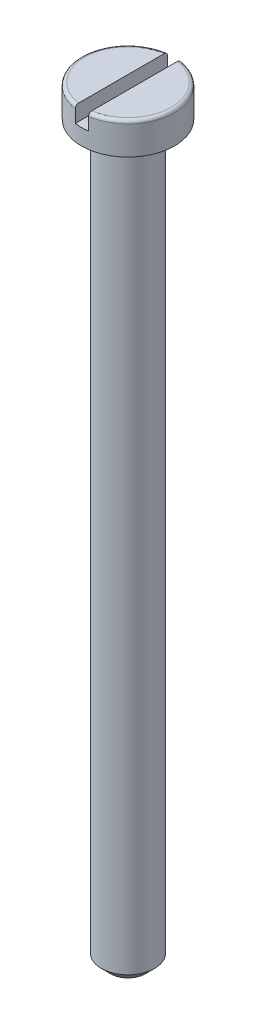
ISO-10303-21;
HEADER;
FILE_DESCRIPTION(('STEP AP214'),'2;1');
FILE_NAME('part.step','',(''),(''),'','','');
FILE_SCHEMA(('AUTOMOTIVE_DESIGN { 1 0 10303 214 1 1 1 1 }'));
ENDSEC;
DATA;
#1=APPLICATION_CONTEXT('core data for automotive mechanical design processes');
#2=APPLICATION_PROTOCOL_DEFINITION('international standard','automotive_design',2000,#1);
#3=PRODUCT_CONTEXT('',#1,'mechanical');
#4=PRODUCT('Part','Part','',(#3));
#5=PRODUCT_RELATED_PRODUCT_CATEGORY('part','',(#4));
#6=PRODUCT_DEFINITION_FORMATION('','',#4);
#7=PRODUCT_DEFINITION_CONTEXT('part definition',#1,'design');
#8=PRODUCT_DEFINITION('design','',#6,#7);
#9=PRODUCT_DEFINITION_SHAPE('','',#8);
#10=(LENGTH_UNIT() NAMED_UNIT(*) SI_UNIT(.MILLI.,.METRE.));
#11=(NAMED_UNIT(*) PLANE_ANGLE_UNIT() SI_UNIT($,.RADIAN.));
#12=(NAMED_UNIT(*) SI_UNIT($,.STERADIAN.) SOLID_ANGLE_UNIT());
#13=UNCERTAINTY_MEASURE_WITH_UNIT(LENGTH_MEASURE(1.E-05),#10,'distance_accuracy_value','');
#14=(GEOMETRIC_REPRESENTATION_CONTEXT(3) GLOBAL_UNCERTAINTY_ASSIGNED_CONTEXT((#13)) GLOBAL_UNIT_ASSIGNED_CONTEXT((#10,
#11,#12)) REPRESENTATION_CONTEXT('',''));
#15=CARTESIAN_POINT('',(0.,0.,0.));
#16=DIRECTION('',(0.,0.,1.));
#17=DIRECTION('',(1.,0.,0.));
#18=AXIS2_PLACEMENT_3D('',#15,#16,#17);
#19=CARTESIAN_POINT('',(0.,2.4,0.));
#20=DIRECTION('',(0.,1.,0.));
#21=DIRECTION('',(-1.,0.,0.));
#22=AXIS2_PLACEMENT_3D('',#19,#20,#21);
#23=CYLINDRICAL_SURFACE('',#22,3.5);
#24=CARTESIAN_POINT('',(0.,0.,0.));
#25=DIRECTION('',(0.,1.,0.));
#26=DIRECTION('',(-1.,0.,0.));
#27=AXIS2_PLACEMENT_3D('',#24,#25,#26);
#28=CIRCLE('',#27,3.5);
#29=CARTESIAN_POINT('',(-3.5,0.,0.));
#30=VERTEX_POINT('',#29);
#31=EDGE_CURVE('E115',#30,#30,#28,.T.);
#32=ORIENTED_EDGE('',*,*,#31,.T.);
#33=EDGE_LOOP('',(#32));
#34=FACE_BOUND('',#33,.T.);
#35=DIRECTION('',(0.,1.,0.));
#36=VECTOR('',#35,1.);
#37=CARTESIAN_POINT('',(0.499999999999999,2.4,3.46410161513775));
#38=LINE('',#37,#36);
#39=CARTESIAN_POINT('',(0.499999999999999,1.2,3.46410161513775));
#40=VERTEX_POINT('',#39);
#41=CARTESIAN_POINT('',(0.499999999999999,2.15999999999947,3.46410161513782));
#42=VERTEX_POINT('',#41);
#43=EDGE_CURVE('E166',#40,#42,#38,.T.);
#44=ORIENTED_EDGE('',*,*,#43,.F.);
#45=CARTESIAN_POINT('',(0.,1.2,0.));
#46=DIRECTION('',(0.,-1.,0.));
#47=DIRECTION('',(0.,0.,-1.));
#48=AXIS2_PLACEMENT_3D('',#45,#46,#47);
#49=CIRCLE('',#48,3.5);
#50=CARTESIAN_POINT('',(-0.500000000000001,1.2,3.46410161513775));
#51=VERTEX_POINT('',#50);
#52=EDGE_CURVE('E11',#40,#51,#49,.T.);
#53=ORIENTED_EDGE('',*,*,#52,.T.);
#54=DIRECTION('',(0.,1.,0.));
#55=VECTOR('',#54,1.);
#56=CARTESIAN_POINT('',(-0.500000000000001,2.4,3.46410161513775));
#57=LINE('',#56,#55);
#58=CARTESIAN_POINT('',(-0.500000000000001,2.15999999999923,3.46410161514339));
#59=VERTEX_POINT('',#58);
#60=EDGE_CURVE('E102',#59,#51,#57,.F.);
#61=ORIENTED_EDGE('',*,*,#60,.F.);
#62=CARTESIAN_POINT('',(0.,2.16,0.));
#63=DIRECTION('',(0.,1.,0.));
#64=DIRECTION('',(-1.,0.,0.));
#65=AXIS2_PLACEMENT_3D('',#62,#63,#64);
#66=CIRCLE('',#65,3.5);
#67=CARTESIAN_POINT('',(-0.5,2.160000000004,-3.46410161516349));
#68=VERTEX_POINT('',#67);
#69=EDGE_CURVE('E101',#68,#59,#66,.T.);
#70=ORIENTED_EDGE('',*,*,#69,.F.);
#71=DIRECTION('',(0.,1.,0.));
#72=VECTOR('',#71,1.);
#73=CARTESIAN_POINT('',(-0.5,2.4,-3.46410161513775));
#74=LINE('',#73,#72);
#75=CARTESIAN_POINT('',(-0.5,1.2,-3.46410161513775));
#76=VERTEX_POINT('',#75);
#77=EDGE_CURVE('E131',#76,#68,#74,.T.);
#78=ORIENTED_EDGE('',*,*,#77,.F.);
#79=CARTESIAN_POINT('',(0.5,1.2,-3.46410161513775));
#80=VERTEX_POINT('',#79);
#81=EDGE_CURVE('E38',#76,#80,#49,.T.);
#82=ORIENTED_EDGE('',*,*,#81,.T.);
#83=DIRECTION('',(0.,1.,0.));
#84=VECTOR('',#83,1.);
#85=CARTESIAN_POINT('',(0.5,2.4,-3.46410161513775));
#86=LINE('',#85,#84);
#87=CARTESIAN_POINT('',(0.5,2.16,-3.46410161513775));
#88=VERTEX_POINT('',#87);
#89=EDGE_CURVE('E107',#88,#80,#86,.F.);
#90=ORIENTED_EDGE('',*,*,#89,.F.);
#91=EDGE_CURVE('E114',#42,#88,#66,.T.);
#92=ORIENTED_EDGE('',*,*,#91,.F.);
#93=EDGE_LOOP('',(#44,#53,#61,#70,#78,#82,#90,#92));
#94=FACE_BOUND('',#93,.T.);
#95=ADVANCED_FACE('F34',(#34,#94),#23,.T.);
#96=CARTESIAN_POINT('',(0.,2.16,0.));
#97=DIRECTION('',(0.,1.,0.));
#98=DIRECTION('',(-1.,0.,0.));
#99=AXIS2_PLACEMENT_3D('',#96,#97,#98);
#100=TOROIDAL_SURFACE('',#99,3.26,0.24);
#101=CARTESIAN_POINT('',(0.5,2.241411028856,-3.44972387759937));
#102=CARTESIAN_POINT('',(0.5,2.22886304295098,-3.4542952341179));
#103=CARTESIAN_POINT('',(0.5,2.21592110891235,-3.45781267380693));
#104=CARTESIAN_POINT('',(0.5,2.1896200210776,-3.46262717209876));
#105=CARTESIAN_POINT('',(0.5,2.17626041187206,-3.46392171444181));
#106=CARTESIAN_POINT('',(0.5,2.1495179765406,-3.4642463732092));
#107=CARTESIAN_POINT('',(0.5,2.13613516216037,-3.46327741657342));
#108=CARTESIAN_POINT('',(0.5,2.10972597661162,-3.4591059150332));
#109=CARTESIAN_POINT('',(0.5,2.09669952377738,-3.4559038864038));
#110=CARTESIAN_POINT('',(0.5,2.07136797171093,-3.44736290151285));
#111=CARTESIAN_POINT('',(0.5,2.05906284473413,-3.44202402750344));
#112=CARTESIAN_POINT('',(0.5,2.03551638978496,-3.4293670241216));
#113=CARTESIAN_POINT('',(0.5,2.02427512011812,-3.42204878635329));
#114=CARTESIAN_POINT('',(0.5,2.00310659913289,-3.40560065008184));
#115=CARTESIAN_POINT('',(0.5,1.99318699464391,-3.3964609129393));
#116=CARTESIAN_POINT('',(0.5,1.9750050290174,-3.37666009434703));
#117=CARTESIAN_POINT('',(0.5,1.96674274264352,-3.36599894430162));
#118=CARTESIAN_POINT('',(0.5,1.95202349338991,-3.34334808764582));
#119=CARTESIAN_POINT('',(0.5,1.94558482161102,-3.33134649596625));
#120=CARTESIAN_POINT('',(0.5,1.93479012245546,-3.30644079110778));
#121=CARTESIAN_POINT('',(0.5,1.93043421030966,-3.29353662803843));
#122=CARTESIAN_POINT('',(0.5,1.92388331562625,-3.26704913949046));
#123=CARTESIAN_POINT('',(0.5,1.92171113692545,-3.25346017220783));
#124=CARTESIAN_POINT('',(0.5,1.91966204452503,-3.22611010372656));
#125=CARTESIAN_POINT('',(0.5,1.91978524018924,-3.21234899435737));
#126=CARTESIAN_POINT('',(0.5,1.92233049987845,-3.18494642839836));
#127=CARTESIAN_POINT('',(0.5,1.92476815321766,-3.17130641678393));
#128=CARTESIAN_POINT('',(0.5,1.93189894606612,-3.14462886869227));
#129=CARTESIAN_POINT('',(0.5,1.93659211471282,-3.13159134000049));
#130=CARTESIAN_POINT('',(0.5,1.94810648813214,-3.10649544180327));
#131=CARTESIAN_POINT('',(0.5,1.95492721642555,-3.09443685381974));
#132=CARTESIAN_POINT('',(0.5,1.97051187167998,-3.07164802720828));
#133=CARTESIAN_POINT('',(0.5,1.97927573199265,-3.06091774303993));
#134=CARTESIAN_POINT('',(0.5,1.99842599985092,-3.04118669217247));
#135=CARTESIAN_POINT('',(0.5,2.0087987380878,-3.03217266301152));
#136=CARTESIAN_POINT('',(0.5,2.03092701859961,-3.01604101129341));
#137=CARTESIAN_POINT('',(0.5,2.04268246113829,-3.00892325207663));
#138=CARTESIAN_POINT('',(0.5,2.06708136126523,-2.99688326290683));
#139=CARTESIAN_POINT('',(0.5,2.07971153041177,-2.99193410340201));
#140=CARTESIAN_POINT('',(0.5,2.10562908289139,-2.98425384684925));
#141=CARTESIAN_POINT('',(0.5,2.11891641876002,-2.98152258985877));
#142=CARTESIAN_POINT('',(0.5,2.14561077381066,-2.97838194468102));
#143=CARTESIAN_POINT('',(0.5,2.1590147672368,-2.97794679388834));
#144=CARTESIAN_POINT('',(0.5,2.18570394487786,-2.97934236410122));
#145=CARTESIAN_POINT('',(0.5,2.19898913300646,-2.98117301018796));
#146=CARTESIAN_POINT('',(0.5,2.22501330006813,-2.98703222894149));
#147=CARTESIAN_POINT('',(0.5,2.23775411885165,-2.99105264051188));
#148=CARTESIAN_POINT('',(0.5,2.26238563572037,-3.00116343557547));
#149=CARTESIAN_POINT('',(0.5,2.27427631635943,-3.00725386153381));
#150=CARTESIAN_POINT('',(0.5,2.29694689335382,-3.0213639548198));
#151=CARTESIAN_POINT('',(0.5,2.30771998193761,-3.02939455508065));
#152=CARTESIAN_POINT('',(0.5,2.32778538562214,-3.04713053021347));
#153=CARTESIAN_POINT('',(0.5,2.33707761510649,-3.05683600185117));
#154=CARTESIAN_POINT('',(0.5,2.35403777264807,-3.07777048933921));
#155=CARTESIAN_POINT('',(0.5,2.36168477333897,-3.08901645832206));
#156=CARTESIAN_POINT('',(0.5,2.37500901374132,-3.11262026309771));
#157=CARTESIAN_POINT('',(0.5,2.38068611600398,-3.12497817640019));
#158=CARTESIAN_POINT('',(0.5,2.38997895962179,-3.15061735939968));
#159=CARTESIAN_POINT('',(0.5,2.3935687029326,-3.16390805595389));
#160=CARTESIAN_POINT('',(0.5,2.39848283782247,-3.19090205442563));
#161=CARTESIAN_POINT('',(0.5,2.39980712116856,-3.20460537602462));
#162=CARTESIAN_POINT('',(0.5,2.40015483453996,-3.23213474621238));
#163=CARTESIAN_POINT('',(0.5,2.39916258258718,-3.24596099638922));
#164=CARTESIAN_POINT('',(0.5,2.39486861618324,-3.2732499261776));
#165=CARTESIAN_POINT('',(0.5,2.39156697792132,-3.28671261776813));
#166=CARTESIAN_POINT('',(0.5,2.3827461639102,-3.31287294205302));
#167=CARTESIAN_POINT('',(0.5,2.37722969664186,-3.32557148747962));
#168=CARTESIAN_POINT('',(0.5,2.36412530944074,-3.34985543999445));
#169=CARTESIAN_POINT('',(0.5,2.35653694589527,-3.36144060797898));
#170=CARTESIAN_POINT('',(0.5,2.33956257113916,-3.38307152336772));
#171=CARTESIAN_POINT('',(0.5,2.33019002050392,-3.39312784330216));
#172=CARTESIAN_POINT('',(0.5,2.30988014095485,-3.41149329671084));
#173=CARTESIAN_POINT('',(0.5,2.29894481695349,-3.41980463563074));
#174=CARTESIAN_POINT('',(0.5,2.28015884506383,-3.43169613995796));
#175=CARTESIAN_POINT('',(0.5,2.27268496262614,-3.43588296088825));
#176=CARTESIAN_POINT('',(0.5,2.25733165593698,-3.44343208174103));
#177=CARTESIAN_POINT('',(0.5,2.24945223397079,-3.44679438630917));
#178=CARTESIAN_POINT('',(0.5,2.241411028856,-3.44972387759937));
#179=B_SPLINE_CURVE_WITH_KNOTS('',3,(#101,#102,#103,#104,#105,#106,#107,#108,#109,#110,#111,
#112,#113,#114,#115,#116,#117,#118,#119,#120,#121,#122,#123,#124,#125,#126,#127,#128,#129,#130,
#131,#132,#133,#134,#135,#136,#137,#138,#139,#140,#141,#142,#143,#144,#145,#146,#147,#148,#149,
#150,#151,#152,#153,#154,#155,#156,#157,#158,#159,#160,#161,#162,#163,#164,#165,#166,#167,#168,
#169,#170,#171,#172,#173,#174,#175,#176,#177,#178),.UNSPECIFIED.,.T.,.F.,(4,2,2,2,2,2,2,2,2,2,2,
2,2,2,2,2,2,2,2,2,2,2,2,2,2,2,2,2,2,2,2,2,2,2,2,2,2,2,4),(0.,0.0400331038687098,
0.0801114943287241,0.120173474909208,0.160226196430201,0.200277376377296,0.240330750091231,
0.280606636277123,0.320884338949179,0.361552777639427,0.402223466093638,0.443314583041823,
0.484407657794234,0.525779498324621,0.56715187332362,0.608514989385775,0.649876686935391,
0.69090448756303,0.731929330615187,0.772429199312397,0.812926147129474,0.852967732598499,
0.893007994123696,0.932900039572516,0.972792903433042,1.01291603449556,1.05304148444987,
1.09365056068564,1.13426246983226,1.17536992663146,1.2164793472957,1.25786786775886,
1.29925502283262,1.34059171958989,1.38193727387697,1.42298244947059,1.46397543239833,
1.48963024392533,1.5152849108995),.UNSPECIFIED.);
#180=CARTESIAN_POINT('',(0.5,2.4,-3.22142825467214));
#181=VERTEX_POINT('',#180);
#182=EDGE_CURVE('E57',#181,#88,#179,.T.);
#183=ORIENTED_EDGE('',*,*,#182,.F.);
#184=CARTESIAN_POINT('',(0.,2.4,0.));
#185=DIRECTION('',(0.,1.,0.));
#186=DIRECTION('',(-1.,0.,0.));
#187=AXIS2_PLACEMENT_3D('',#184,#185,#186);
#188=CIRCLE('',#187,3.26);
#189=CARTESIAN_POINT('',(0.499999999999999,2.4,3.22142825467214));
#190=VERTEX_POINT('',#189);
#191=EDGE_CURVE('E106',#190,#181,#188,.T.);
#192=ORIENTED_EDGE('',*,*,#191,.F.);
#193=CARTESIAN_POINT('',(0.499999999999999,2.21283978617363,2.98429292851152));
#194=CARTESIAN_POINT('',(0.499999999999999,2.19986519316829,2.98132431302034));
#195=CARTESIAN_POINT('',(0.499999999999999,2.18663096290837,2.97944828007187));
#196=CARTESIAN_POINT('',(0.499999999999999,2.16002502373158,2.97794615262757));
#197=CARTESIAN_POINT('',(0.499999999999999,2.14665317618123,2.97832260675978));
#198=CARTESIAN_POINT('',(0.499999999999999,2.12016898919819,2.98131687694796));
#199=CARTESIAN_POINT('',(0.499999999999999,2.10705651646501,2.98393350938623));
#200=CARTESIAN_POINT('',(0.499999999999999,2.08145890891832,2.99132562550046));
#201=CARTESIAN_POINT('',(0.499999999999999,2.06897363813571,2.99610063900422));
#202=CARTESIAN_POINT('',(0.499999999999999,2.04494502071232,3.00767872680103));
#203=CARTESIAN_POINT('',(0.499999999999999,2.03340402915845,3.01448668606071));
#204=CARTESIAN_POINT('',(0.499999999999999,2.01161266376119,3.02992448738182));
#205=CARTESIAN_POINT('',(0.499999999999999,2.00136239485456,3.03855447742329));
#206=CARTESIAN_POINT('',(0.499999999999999,1.98232568044956,3.05748699476943));
#207=CARTESIAN_POINT('',(0.499999999999999,1.97355592360274,3.06780629937927));
#208=CARTESIAN_POINT('',(0.499999999999999,1.95784694174626,3.08975484707196));
#209=CARTESIAN_POINT('',(0.499999999999999,1.95090784067098,3.10138417876692));
#210=CARTESIAN_POINT('',(0.499999999999999,1.93896464507331,3.12578346630434));
#211=CARTESIAN_POINT('',(0.499999999999999,1.93398658393807,3.13856616796299));
#212=CARTESIAN_POINT('',(0.499999999999999,1.92622542083894,3.1647814814169));
#213=CARTESIAN_POINT('',(0.499999999999999,1.92344243766632,3.17821412834357));
#214=CARTESIAN_POINT('',(0.499999999999999,1.92013065820617,3.20547727972935));
#215=CARTESIAN_POINT('',(0.499999999999999,1.91962231061821,3.21931027248909));
#216=CARTESIAN_POINT('',(0.499999999999999,1.92093120565128,3.24686611552672));
#217=CARTESIAN_POINT('',(0.499999999999999,1.92274849606962,3.26058896353504));
#218=CARTESIAN_POINT('',(0.499999999999999,1.92866710334455,3.28755444554248));
#219=CARTESIAN_POINT('',(0.499999999999999,1.93277174246903,3.30079635112651));
#220=CARTESIAN_POINT('',(0.499999999999999,1.94315892084316,3.3263968893106));
#221=CARTESIAN_POINT('',(0.499999999999999,1.94944140898974,3.3387555426279));
#222=CARTESIAN_POINT('',(0.499999999999999,1.96397001257343,3.36215769880801));
#223=CARTESIAN_POINT('',(0.499999999999999,1.97220425309163,3.37320857147537));
#224=CARTESIAN_POINT('',(0.499999999999999,1.99042870822969,3.39375300296016));
#225=CARTESIAN_POINT('',(0.499999999999999,2.00041883045596,3.40324664366756));
#226=CARTESIAN_POINT('',(0.499999999999999,2.02176301853091,3.42030339332981));
#227=CARTESIAN_POINT('',(0.499999999999999,2.03310217018992,3.42788516453556));
#228=CARTESIAN_POINT('',(0.499999999999999,2.05690261484815,3.44101474130779));
#229=CARTESIAN_POINT('',(0.499999999999999,2.06936384204195,3.44656266605492));
#230=CARTESIAN_POINT('',(0.499999999999999,2.09491973535609,3.45541062725799));
#231=CARTESIAN_POINT('',(0.499999999999999,2.10800677393132,3.45873270157039));
#232=CARTESIAN_POINT('',(0.499999999999999,2.13455392105263,3.46311740825697));
#233=CARTESIAN_POINT('',(0.499999999999999,2.14801401407342,3.46418013451522));
#234=CARTESIAN_POINT('',(0.499999999999999,2.17483708852678,3.46401454746467));
#235=CARTESIAN_POINT('',(0.499999999999999,2.18820015891081,3.4628002568488));
#236=CARTESIAN_POINT('',(0.499999999999999,2.21453233086588,3.45814483845722));
#237=CARTESIAN_POINT('',(0.499999999999999,2.22750143678298,3.45470373525613));
#238=CARTESIAN_POINT('',(0.499999999999999,2.25267783292822,3.44569813275428));
#239=CARTESIAN_POINT('',(0.499999999999999,2.26488522177294,3.44013390899225));
#240=CARTESIAN_POINT('',(0.499999999999999,2.28819996361806,3.42704645737416));
#241=CARTESIAN_POINT('',(0.499999999999999,2.29930729177591,3.41952318529108));
#242=CARTESIAN_POINT('',(0.499999999999999,2.32017873841556,3.40268709846471));
#243=CARTESIAN_POINT('',(0.499999999999999,2.32993459862631,3.39336404883386));
#244=CARTESIAN_POINT('',(0.499999999999999,2.34776116567061,3.37322656633501));
#245=CARTESIAN_POINT('',(0.499999999999999,2.35583179430408,3.36241206429753));
#246=CARTESIAN_POINT('',(0.499999999999999,2.37014426134107,3.33948557510461));
#247=CARTESIAN_POINT('',(0.499999999999999,2.3763673335374,3.32736187356411));
#248=CARTESIAN_POINT('',(0.499999999999999,2.38671340054557,3.30224933719932));
#249=CARTESIAN_POINT('',(0.499999999999999,2.39083627123654,3.28926045129435));
#250=CARTESIAN_POINT('',(0.499999999999999,2.39690706200746,3.26264363053098));
#251=CARTESIAN_POINT('',(0.499999999999999,2.39883225475687,3.24901050991259));
#252=CARTESIAN_POINT('',(0.499999999999999,2.40038273342458,3.22161391565458));
#253=CARTESIAN_POINT('',(0.499999999999999,2.40000791153046,3.20785043593462));
#254=CARTESIAN_POINT('',(0.499999999999999,2.39696004643142,3.18048936851075));
#255=CARTESIAN_POINT('',(0.499999999999999,2.39427209271802,3.16689343879399));
#256=CARTESIAN_POINT('',(0.499999999999999,2.38665070514893,3.14034634193723));
#257=CARTESIAN_POINT('',(0.499999999999999,2.38171733280422,3.12739515714589));
#258=CARTESIAN_POINT('',(0.499999999999999,2.36974261077214,3.10251874806705));
#259=CARTESIAN_POINT('',(0.499999999999999,2.36270288315781,3.09059274336829));
#260=CARTESIAN_POINT('',(0.499999999999999,2.34670294808307,3.0681017494341));
#261=CARTESIAN_POINT('',(0.499999999999999,2.3377423315855,3.05753705084573));
#262=CARTESIAN_POINT('',(0.499999999999999,2.31823047380927,3.03816730847216));
#263=CARTESIAN_POINT('',(0.499999999999999,2.30769246985555,3.02934891970898));
#264=CARTESIAN_POINT('',(0.499999999999999,2.28527710802292,3.01364337770778));
#265=CARTESIAN_POINT('',(0.499999999999999,2.27340150520626,3.00675373422207));
#266=CARTESIAN_POINT('',(0.499999999999999,2.25332758729241,2.99730778677366));
#267=CARTESIAN_POINT('',(0.499999999999999,2.24543039160945,2.99409696493856));
#268=CARTESIAN_POINT('',(0.499999999999999,2.22933749231037,2.98853929723433));
#269=CARTESIAN_POINT('',(0.499999999999999,2.22114179073409,2.98619244546252));
#270=CARTESIAN_POINT('',(0.499999999999999,2.21283978617363,2.98429292851152));
#271=B_SPLINE_CURVE_WITH_KNOTS('',3,(#193,#194,#195,#196,#197,#198,#199,#200,#201,#202,#203,
#204,#205,#206,#207,#208,#209,#210,#211,#212,#213,#214,#215,#216,#217,#218,#219,#220,#221,#222,
#223,#224,#225,#226,#227,#228,#229,#230,#231,#232,#233,#234,#235,#236,#237,#238,#239,#240,#241,
#242,#243,#244,#245,#246,#247,#248,#249,#250,#251,#252,#253,#254,#255,#256,#257,#258,#259,#260,
#261,#262,#263,#264,#265,#266,#267,#268,#269,#270),.UNSPECIFIED.,.T.,.F.,(4,2,2,2,2,2,2,2,2,2,2,
2,2,2,2,2,2,2,2,2,2,2,2,2,2,2,2,2,2,2,2,2,2,2,2,2,2,2,4),(0.,0.0398985534438492,
0.0798422595490389,0.11976487406519,0.159678796203142,0.199689410047839,0.239703274689377,
0.280141771892861,0.320583006058263,0.361544345438588,0.402507901376288,0.443838984358249,
0.485170916804569,0.526563039027423,0.567954190053036,0.609099694849666,0.650243035238712,
0.690967695418176,0.731689968806493,0.772002851185844,0.812314058386533,0.852377829551939,
0.892441158589783,0.932499289973609,0.972558325779237,1.01285226090427,1.05314806538053,
1.09384016704641,1.13453467331644,1.17564631498358,1.21675988375983,1.25814047392379,
1.29951993057662,1.34086760317863,1.38222408918183,1.4232511820818,1.4642250570465,
1.48975497043957,1.51528470940789),.UNSPECIFIED.);
#272=EDGE_CURVE('E162',#42,#190,#271,.T.);
#273=ORIENTED_EDGE('',*,*,#272,.F.);
#274=ORIENTED_EDGE('',*,*,#91,.T.);
#275=EDGE_LOOP('',(#183,#192,#273,#274));
#276=FACE_BOUND('',#275,.T.);
#277=ADVANCED_FACE('F148',(#276),#100,.T.);
#278=CARTESIAN_POINT('',(-0.5,2.241411028856,-3.44972387759937));
#279=CARTESIAN_POINT('',(-0.5,2.25407251178384,-3.44510986491121));
#280=CARTESIAN_POINT('',(-0.5,2.26635138137016,-3.43941588033839));
#281=CARTESIAN_POINT('',(-0.5,2.28978537699819,-3.42603677602678));
#282=CARTESIAN_POINT('',(-0.5,2.30093903960501,-3.41834910853682));
#283=CARTESIAN_POINT('',(-0.5,2.3217911656687,-3.40121997213796));
#284=CARTESIAN_POINT('',(-0.5,2.33149090488089,-3.39178005722748));
#285=CARTESIAN_POINT('',(-0.5,2.34917889296569,-3.37141920260589));
#286=CARTESIAN_POINT('',(-0.5,2.35716755047674,-3.36049861752626));
#287=CARTESIAN_POINT('',(-0.5,2.37127692374465,-3.33739963530802));
#288=CARTESIAN_POINT('',(-0.5,2.37738336859737,-3.32521252247953));
#289=CARTESIAN_POINT('',(-0.5,2.38748741990338,-3.29999291231573));
#290=CARTESIAN_POINT('',(-0.5,2.3914848248536,-3.28696033433604));
#291=CARTESIAN_POINT('',(-0.5,2.39729743006474,-3.26027781449337));
#292=CARTESIAN_POINT('',(-0.5,2.39908996145389,-3.24662293228321));
#293=CARTESIAN_POINT('',(-0.5,2.4003729371703,-3.21920528116086));
#294=CARTESIAN_POINT('',(-0.5,2.39986328163007,-3.20544250759427));
#295=CARTESIAN_POINT('',(-0.5,2.3965465203833,-3.17810805444934));
#296=CARTESIAN_POINT('',(-0.5,2.39372494117068,-3.16453812815857));
#297=CARTESIAN_POINT('',(-0.5,2.38584194888541,-3.13806483480257));
#298=CARTESIAN_POINT('',(-0.5,2.38078051895819,-3.12516147275397));
#299=CARTESIAN_POINT('',(-0.5,2.36855958831222,-3.10040359516163));
#300=CARTESIAN_POINT('',(-0.5,2.3614019746987,-3.08854814866718));
#301=CARTESIAN_POINT('',(-0.5,2.3451816807803,-3.06622066260405));
#302=CARTESIAN_POINT('',(-0.5,2.33611907140627,-3.05574857155097));
#303=CARTESIAN_POINT('',(-0.5,2.31642642081192,-3.03658566255675));
#304=CARTESIAN_POINT('',(-0.5,2.3058106074372,-3.02788022806488));
#305=CARTESIAN_POINT('',(-0.5,2.28325206841105,-3.01240298092657));
#306=CARTESIAN_POINT('',(-0.5,2.27130944125926,-3.00563102487617));
#307=CARTESIAN_POINT('',(-0.5,2.24660187055417,-2.99430575221752));
#308=CARTESIAN_POINT('',(-0.5,2.23384955787092,-2.98972487771332));
#309=CARTESIAN_POINT('',(-0.5,2.20775227940506,-2.98279555598152));
#310=CARTESIAN_POINT('',(-0.5,2.19440735518515,-2.98044695245203));
#311=CARTESIAN_POINT('',(-0.5,2.16765830732837,-2.97806901414393));
#312=CARTESIAN_POINT('',(-0.5,2.15425638226942,-2.9780148877618));
#313=CARTESIAN_POINT('',(-0.5,2.12763524322737,-2.98016480961656));
#314=CARTESIAN_POINT('',(-0.5,2.11441602402418,-2.98236879320117));
#315=CARTESIAN_POINT('',(-0.5,2.08857412493396,-2.98895688341006));
#316=CARTESIAN_POINT('',(-0.5,2.07594982166191,-2.99333462975642));
#317=CARTESIAN_POINT('',(-0.5,2.05160852576162,-3.00413413584333));
#318=CARTESIAN_POINT('',(-0.5,2.03989155515002,-3.01055594516423));
#319=CARTESIAN_POINT('',(-0.5,2.0176129272202,-3.02530076706149));
#320=CARTESIAN_POINT('',(-0.5,2.00705925076585,-3.03363583316489));
#321=CARTESIAN_POINT('',(-0.5,1.98747960701721,-3.05193972670321));
#322=CARTESIAN_POINT('',(-0.5,1.97845373254201,-3.06190865332826));
#323=CARTESIAN_POINT('',(-0.5,1.96206695838535,-3.0833280534215));
#324=CARTESIAN_POINT('',(-0.5,1.95472793416862,-3.09479526185934));
#325=CARTESIAN_POINT('',(-0.5,1.94205262839953,-3.11878768556407));
#326=CARTESIAN_POINT('',(-0.5,1.93671648217873,-3.13131297225377));
#327=CARTESIAN_POINT('',(-0.5,1.92813520345162,-3.15722686818916));
#328=CARTESIAN_POINT('',(-0.5,1.92491578185021,-3.17062399564905));
#329=CARTESIAN_POINT('',(-0.5,1.92075635324507,-3.19776772902716));
#330=CARTESIAN_POINT('',(-0.5,1.91981644223231,-3.21151434963803));
#331=CARTESIAN_POINT('',(-0.5,1.92024409267781,-3.23905675702395));
#332=CARTESIAN_POINT('',(-0.5,1.92162588319199,-3.25285232610743));
#333=CARTESIAN_POINT('',(-0.5,1.92668981978827,-3.28001499440834));
#334=CARTESIAN_POINT('',(-0.5,1.93037197460199,-3.29338209199918));
#335=CARTESIAN_POINT('',(-0.5,1.93993132207505,-3.3192805988893));
#336=CARTESIAN_POINT('',(-0.5,1.94580462937471,-3.3318134414109));
#337=CARTESIAN_POINT('',(-0.5,1.95958863225764,-3.35570405366884));
#338=CARTESIAN_POINT('',(-0.5,1.96749925478146,-3.36706186552207));
#339=CARTESIAN_POINT('',(-0.5,1.98506683809155,-3.38817914176873));
#340=CARTESIAN_POINT('',(-0.5,1.99470907662246,-3.39795085126065));
#341=CARTESIAN_POINT('',(-0.5,2.01551241835608,-3.41571506174908));
#342=CARTESIAN_POINT('',(-0.5,2.02667337293378,-3.42370773664447));
#343=CARTESIAN_POINT('',(-0.5,2.05006846858447,-3.43759676646178));
#344=CARTESIAN_POINT('',(-0.5,2.06228976910627,-3.44351475369732));
#345=CARTESIAN_POINT('',(-0.5,2.0875620326267,-3.45319537055686));
#346=CARTESIAN_POINT('',(-0.5,2.10061316110479,-3.45695756877887));
#347=CARTESIAN_POINT('',(-0.5,2.12705227149286,-3.46218803065944));
#348=CARTESIAN_POINT('',(-0.5,2.14043652623217,-3.46367520440295));
#349=CARTESIAN_POINT('',(-0.5,2.1672525220739,-3.4643684898972));
#350=CARTESIAN_POINT('',(-0.5,2.18068418202334,-3.46357747542448));
#351=CARTESIAN_POINT('',(-0.5,2.20203437689291,-3.4604966113501));
#352=CARTESIAN_POINT('',(-0.5,2.21006109336748,-3.45891118648247));
#353=CARTESIAN_POINT('',(-0.5,2.22590914583893,-3.45492426403907));
#354=CARTESIAN_POINT('',(-0.5,2.23373048288862,-3.45252277064748));
#355=CARTESIAN_POINT('',(-0.5,2.241411028856,-3.44972387759937));
#356=B_SPLINE_CURVE_WITH_KNOTS('',3,(#278,#279,#280,#281,#282,#283,#284,#285,#286,#287,#288,
#289,#290,#291,#292,#293,#294,#295,#296,#297,#298,#299,#300,#301,#302,#303,#304,#305,#306,#307,
#308,#309,#310,#311,#312,#313,#314,#315,#316,#317,#318,#319,#320,#321,#322,#323,#324,#325,#326,
#327,#328,#329,#330,#331,#332,#333,#334,#335,#336,#337,#338,#339,#340,#341,#342,#343,#344,#345,
#346,#347,#348,#349,#350,#351,#352,#353,#354,#355),.UNSPECIFIED.,.T.,.F.,(4,2,2,2,2,2,2,2,2,2,2,
2,2,2,2,2,2,2,2,2,2,2,2,2,2,2,2,2,2,2,2,2,2,2,2,2,2,2,4),(0.,0.0403977834059923,
0.0808474482153848,0.121261409753667,0.161665708891364,0.202369217023135,0.243076613368162,
0.284199126143681,0.325323422806204,0.366707157919991,0.408091204446045,0.449438108600107,
0.490783473510919,0.531771405490588,0.572756296650525,0.613211191861304,0.653663254242947,
0.693678123324162,0.733691846765437,0.773589176684762,0.813487474419112,0.853644387396869,
0.893803739166559,0.934457705337972,0.975114417944506,1.01625626858729,1.05739985169747,
1.09879651309268,1.1401933316201,1.1815170913782,1.22283936944591,1.2638256608601,
1.30480794414336,1.34534923072534,1.38589862732594,1.42610910856929,1.46626888930192,
1.49077459886606,1.5152801827853),.UNSPECIFIED.);
#357=CARTESIAN_POINT('',(-0.5,2.4,-3.22142825467214));
#358=VERTEX_POINT('',#357);
#359=EDGE_CURVE('E49',#68,#358,#356,.T.);
#360=ORIENTED_EDGE('',*,*,#359,.F.);
#361=ORIENTED_EDGE('',*,*,#69,.T.);
#362=CARTESIAN_POINT('',(-0.500000000000001,2.21283978617363,2.98429292851152));
#363=CARTESIAN_POINT('',(-0.500000000000001,2.2259291162559,2.98728907755388));
#364=CARTESIAN_POINT('',(-0.500000000000001,2.23877339471037,2.99140173870466));
#365=CARTESIAN_POINT('',(-0.500000000000001,2.26359601370013,3.00173617951726));
#366=CARTESIAN_POINT('',(-0.500000000000001,2.27557321787459,3.00796066825878));
#367=CARTESIAN_POINT('',(-0.500000000000001,2.29830462253936,3.02232204946622));
#368=CARTESIAN_POINT('',(-0.500000000000001,2.30905999540159,3.03045708533024));
#369=CARTESIAN_POINT('',(-0.500000000000001,2.32906437448749,3.04839999697116));
#370=CARTESIAN_POINT('',(-0.500000000000001,2.33831372527012,3.05820748905683));
#371=CARTESIAN_POINT('',(-0.500000000000001,2.35514028785187,3.07931044143551));
#372=CARTESIAN_POINT('',(-0.500000000000001,2.36270167258693,3.09061851944227));
#373=CARTESIAN_POINT('',(-0.500000000000001,2.37584574266711,3.11433197047002));
#374=CARTESIAN_POINT('',(-0.500000000000001,2.38142822180721,3.12673745767454));
#375=CARTESIAN_POINT('',(-0.500000000000001,2.39052344644016,3.15245524666066));
#376=CARTESIAN_POINT('',(-0.500000000000001,2.39401025009192,3.1657767268042));
#377=CARTESIAN_POINT('',(-0.500000000000001,2.39871439624262,3.19281471579722));
#378=CARTESIAN_POINT('',(-0.500000000000001,2.39993163763755,3.20653124221748));
#379=CARTESIAN_POINT('',(-0.500000000000001,2.40006318046154,3.23406639956516));
#380=CARTESIAN_POINT('',(-0.500000000000001,2.39896222717903,3.24788510681262));
#381=CARTESIAN_POINT('',(-0.500000000000001,2.39445321790945,3.27514117417658));
#382=CARTESIAN_POINT('',(-0.500000000000001,2.3910451567891,3.28857853344451));
#383=CARTESIAN_POINT('',(-0.500000000000001,2.38201706147934,3.31466943159608));
#384=CARTESIAN_POINT('',(-0.500000000000001,2.37639989879728,3.32732396342633));
#385=CARTESIAN_POINT('',(-0.500000000000001,2.3631045083654,3.35149997945255));
#386=CARTESIAN_POINT('',(-0.500000000000001,2.35542635152152,3.36302150260964));
#387=CARTESIAN_POINT('',(-0.500000000000001,2.33828894126066,3.38450540366933));
#388=CARTESIAN_POINT('',(-0.500000000000001,2.32884416262078,3.39447932538643));
#389=CARTESIAN_POINT('',(-0.500000000000001,2.30839822766145,3.41267901424814));
#390=CARTESIAN_POINT('',(-0.500000000000001,2.29739716173496,3.42090488285456));
#391=CARTESIAN_POINT('',(-0.500000000000001,2.27427650063313,3.4352822782686));
#392=CARTESIAN_POINT('',(-0.500000000000001,2.26217003888127,3.44145492635328));
#393=CARTESIAN_POINT('',(-0.500000000000001,2.23708597429806,3.45165874110316));
#394=CARTESIAN_POINT('',(-0.500000000000001,2.22410841923472,3.45569002508607));
#395=CARTESIAN_POINT('',(-0.500000000000001,2.19777705901048,3.46146189481267));
#396=CARTESIAN_POINT('',(-0.500000000000001,2.18442772734291,3.46322290128716));
#397=CARTESIAN_POINT('',(-0.500000000000001,2.15762346220514,3.46446829371069));
#398=CARTESIAN_POINT('',(-0.500000000000001,2.1441685321294,3.46395275254261));
#399=CARTESIAN_POINT('',(-0.500000000000001,2.11759441068146,3.46066774791239));
#400=CARTESIAN_POINT('',(-0.500000000000001,2.10447404781906,3.45790774717163));
#401=CARTESIAN_POINT('',(-0.500000000000001,2.07888153083504,3.45022851158597));
#402=CARTESIAN_POINT('',(-0.500000000000001,2.06640937726941,3.44530927488904));
#403=CARTESIAN_POINT('',(-0.500000000000001,2.04243749917633,3.43344508167596));
#404=CARTESIAN_POINT('',(-0.500000000000001,2.03093982138113,3.42649599146436));
#405=CARTESIAN_POINT('',(-0.500000000000001,2.00926299454857,3.41077976876051));
#406=CARTESIAN_POINT('',(-0.500000000000001,1.99908388785121,3.40201257791161));
#407=CARTESIAN_POINT('',(-0.500000000000001,1.98024882994886,3.38284035637903));
#408=CARTESIAN_POINT('',(-0.500000000000001,1.97160496791699,3.37242345157397));
#409=CARTESIAN_POINT('',(-0.500000000000001,1.95616733904855,3.35029898349095));
#410=CARTESIAN_POINT('',(-0.500000000000001,1.94937367095438,3.33859135137541));
#411=CARTESIAN_POINT('',(-0.500000000000001,1.93775400989398,3.31408719144148));
#412=CARTESIAN_POINT('',(-0.500000000000001,1.93294929515702,3.3012805735166));
#413=CARTESIAN_POINT('',(-0.500000000000001,1.92553552164421,3.27504685977699));
#414=CARTESIAN_POINT('',(-0.500000000000001,1.92292658267106,3.26161973014897));
#415=CARTESIAN_POINT('',(-0.500000000000001,1.91995646214934,3.23439088081926));
#416=CARTESIAN_POINT('',(-0.500000000000001,1.91961667650216,3.2205868244565));
#417=CARTESIAN_POINT('',(-0.500000000000001,1.92124855182133,3.19311572606599));
#418=CARTESIAN_POINT('',(-0.500000000000001,1.92322030046505,3.17944868925526));
#419=CARTESIAN_POINT('',(-0.500000000000001,1.92943525824974,3.15257887676437));
#420=CARTESIAN_POINT('',(-0.500000000000001,1.93368817692728,3.13937834461878));
#421=CARTESIAN_POINT('',(-0.500000000000001,1.94435719923027,3.11388195854808));
#422=CARTESIAN_POINT('',(-0.500000000000001,1.95077329513254,3.1015861013932));
#423=CARTESIAN_POINT('',(-0.500000000000001,1.96556890578416,3.07829766335306));
#424=CARTESIAN_POINT('',(-0.500000000000001,1.9739415677731,3.06730073093957));
#425=CARTESIAN_POINT('',(-0.500000000000001,1.99243203289831,3.04688782007713));
#426=CARTESIAN_POINT('',(-0.500000000000001,2.00254967582091,3.03747169664428));
#427=CARTESIAN_POINT('',(-0.500000000000001,2.02412952909341,3.02059721841028));
#428=CARTESIAN_POINT('',(-0.500000000000001,2.03557624000889,3.01311904508764));
#429=CARTESIAN_POINT('',(-0.500000000000001,2.0595789832515,3.00021834442286));
#430=CARTESIAN_POINT('',(-0.500000000000001,2.0721352121779,2.99479618229658));
#431=CARTESIAN_POINT('',(-0.500000000000001,2.09782680339825,2.98623432934613));
#432=CARTESIAN_POINT('',(-0.500000000000001,2.11095294378061,2.98306690477741));
#433=CARTESIAN_POINT('',(-0.500000000000001,2.13754090618407,2.97900738791427));
#434=CARTESIAN_POINT('',(-0.500000000000001,2.15100226949776,2.97811234219412));
#435=CARTESIAN_POINT('',(-0.500000000000001,2.1725755988232,2.97851527381322));
#436=CARTESIAN_POINT('',(-0.500000000000001,2.18070775353432,2.97908877074417));
#437=CARTESIAN_POINT('',(-0.500000000000001,2.19686992260407,2.98106888561827));
#438=CARTESIAN_POINT('',(-0.500000000000001,2.20489993784163,2.98247549638727));
#439=CARTESIAN_POINT('',(-0.500000000000001,2.21283978617363,2.98429292851152));
#440=B_SPLINE_CURVE_WITH_KNOTS('',3,(#362,#363,#364,#365,#366,#367,#368,#369,#370,#371,#372,
#373,#374,#375,#376,#377,#378,#379,#380,#381,#382,#383,#384,#385,#386,#387,#388,#389,#390,#391,
#392,#393,#394,#395,#396,#397,#398,#399,#400,#401,#402,#403,#404,#405,#406,#407,#408,#409,#410,
#411,#412,#413,#414,#415,#416,#417,#418,#419,#420,#421,#422,#423,#424,#425,#426,#427,#428,#429,
#430,#431,#432,#433,#434,#435,#436,#437,#438,#439),.UNSPECIFIED.,.T.,.F.,(4,2,2,2,2,2,2,2,2,2,2,
2,2,2,2,2,2,2,2,2,2,2,2,2,2,2,2,2,2,2,2,2,2,2,2,2,2,2,4),(0.,0.0402534430619013,
0.0805587202387704,0.12082499106835,0.161082036496188,0.201702021831346,0.242326238588488,
0.283443495747855,0.324562584546779,0.365953099843659,0.407343707234011,0.448680689804159,
0.490016250408859,0.531026891672887,0.572035151915958,0.612607483096343,0.653177591233877,
0.693380172480137,0.733581466663968,0.773614144103432,0.813646855879961,0.85376166750978,
0.89387776692802,0.934296960941998,0.974718311652198,1.01556156995129,1.05640705653589,
1.09763713899734,1.138868785382,1.18027733856013,1.22168574389918,1.26295123666071,
1.30421294268777,1.34503435940821,1.38586302397469,1.42618037805354,1.46644530451421,
1.4908628249631,1.51528013514958),.UNSPECIFIED.);
#441=CARTESIAN_POINT('',(-0.500000000000001,2.4,3.22142825467214));
#442=VERTEX_POINT('',#441);
#443=EDGE_CURVE('E88',#442,#59,#440,.T.);
#444=ORIENTED_EDGE('',*,*,#443,.F.);
#445=EDGE_CURVE('E99',#358,#442,#188,.T.);
#446=ORIENTED_EDGE('',*,*,#445,.F.);
#447=EDGE_LOOP('',(#360,#361,#444,#446));
#448=FACE_BOUND('',#447,.T.);
#449=ADVANCED_FACE('F98',(#448),#100,.T.);
#450=CARTESIAN_POINT('',(0.,2.4,0.));
#451=DIRECTION('',(0.,-1.,0.));
#452=DIRECTION('',(1.,0.,0.));
#453=AXIS2_PLACEMENT_3D('',#450,#451,#452);
#454=PLANE('',#453);
#455=DIRECTION('',(0.,0.,-1.));
#456=VECTOR('',#455,1.);
#457=CARTESIAN_POINT('',(0.499999999999999,2.4,0.));
#458=LINE('',#457,#456);
#459=EDGE_CURVE('E93',#190,#181,#458,.T.);
#460=ORIENTED_EDGE('',*,*,#459,.F.);
#461=ORIENTED_EDGE('',*,*,#191,.T.);
#462=EDGE_LOOP('',(#460,#461));
#463=FACE_BOUND('',#462,.T.);
#464=ADVANCED_FACE('F173',(#463),#454,.F.);
#465=DIRECTION('',(0.,0.,1.));
#466=VECTOR('',#465,1.);
#467=CARTESIAN_POINT('',(-0.500000000000001,2.4,0.));
#468=LINE('',#467,#466);
#469=EDGE_CURVE('E85',#358,#442,#468,.T.);
#470=ORIENTED_EDGE('',*,*,#469,.F.);
#471=ORIENTED_EDGE('',*,*,#445,.T.);
#472=EDGE_LOOP('',(#470,#471));
#473=FACE_BOUND('',#472,.T.);
#474=ADVANCED_FACE('F105',(#473),#454,.F.);
#475=CARTESIAN_POINT('',(0.,-55.,0.));
#476=DIRECTION('',(0.,1.,0.));
#477=DIRECTION('',(0.,0.,1.));
#478=AXIS2_PLACEMENT_3D('',#475,#476,#477);
#479=CYLINDRICAL_SURFACE('',#478,2.);
#480=CARTESIAN_POINT('',(0.,-54.3,0.));
#481=DIRECTION('',(0.,1.,0.));
#482=DIRECTION('',(0.,0.,1.));
#483=AXIS2_PLACEMENT_3D('',#480,#481,#482);
#484=CIRCLE('',#483,2.);
#485=CARTESIAN_POINT('',(0.,-54.3,2.));
#486=VERTEX_POINT('',#485);
#487=EDGE_CURVE('E121',#486,#486,#484,.T.);
#488=ORIENTED_EDGE('',*,*,#487,.T.);
#489=EDGE_LOOP('',(#488));
#490=FACE_BOUND('',#489,.T.);
#491=CARTESIAN_POINT('',(0.,0.,0.));
#492=DIRECTION('',(0.,1.,0.));
#493=DIRECTION('',(0.,0.,1.));
#494=AXIS2_PLACEMENT_3D('',#491,#492,#493);
#495=CIRCLE('',#494,2.);
#496=CARTESIAN_POINT('',(0.,0.,2.));
#497=VERTEX_POINT('',#496);
#498=EDGE_CURVE('E118',#497,#497,#495,.T.);
#499=ORIENTED_EDGE('',*,*,#498,.F.);
#500=EDGE_LOOP('',(#499));
#501=FACE_BOUND('',#500,.T.);
#502=ADVANCED_FACE('F179',(#490,#501),#479,.T.);
#503=CARTESIAN_POINT('',(0.,-55.,0.));
#504=DIRECTION('',(0.,1.,0.));
#505=DIRECTION('',(0.,0.,1.));
#506=AXIS2_PLACEMENT_3D('',#503,#504,#505);
#507=PLANE('',#506);
#508=CARTESIAN_POINT('',(0.,-55.,0.));
#509=DIRECTION('',(0.,1.,0.));
#510=DIRECTION('',(0.,0.,1.));
#511=AXIS2_PLACEMENT_3D('',#508,#509,#510);
#512=CIRCLE('',#511,1.3);
#513=CARTESIAN_POINT('',(0.,-55.,1.3));
#514=VERTEX_POINT('',#513);
#515=EDGE_CURVE('E94',#514,#514,#512,.F.);
#516=ORIENTED_EDGE('',*,*,#515,.T.);
#517=EDGE_LOOP('',(#516));
#518=FACE_BOUND('',#517,.T.);
#519=ADVANCED_FACE('F190',(#518),#507,.F.);
#520=CARTESIAN_POINT('',(0.,-54.3,0.));
#521=DIRECTION('',(0.,1.,0.));
#522=DIRECTION('',(0.,0.,1.));
#523=AXIS2_PLACEMENT_3D('',#520,#521,#522);
#524=CONICAL_SURFACE('',#523,2.,0.785398163397444);
#525=ORIENTED_EDGE('',*,*,#515,.F.);
#526=EDGE_LOOP('',(#525));
#527=FACE_BOUND('',#526,.T.);
#528=ORIENTED_EDGE('',*,*,#487,.F.);
#529=EDGE_LOOP('',(#528));
#530=FACE_BOUND('',#529,.T.);
#531=ADVANCED_FACE('F36',(#527,#530),#524,.T.);
#532=CARTESIAN_POINT('',(0.,0.,0.));
#533=DIRECTION('',(0.,1.,0.));
#534=DIRECTION('',(-1.,0.,0.));
#535=AXIS2_PLACEMENT_3D('',#532,#533,#534);
#536=PLANE('',#535);
#537=ORIENTED_EDGE('',*,*,#498,.T.);
#538=EDGE_LOOP('',(#537));
#539=FACE_BOUND('',#538,.T.);
#540=ORIENTED_EDGE('',*,*,#31,.F.);
#541=EDGE_LOOP('',(#540));
#542=FACE_BOUND('',#541,.T.);
#543=ADVANCED_FACE('F186',(#539,#542),#536,.F.);
#544=CARTESIAN_POINT('',(0.499999999999999,1.2,3.5));
#545=DIRECTION('',(0.,-1.,0.));
#546=DIRECTION('',(0.,0.,-1.));
#547=AXIS2_PLACEMENT_3D('',#544,#545,#546);
#548=PLANE('',#547);
#549=DIRECTION('',(0.,0.,1.));
#550=VECTOR('',#549,1.);
#551=CARTESIAN_POINT('',(0.5,1.2,-3.5));
#552=LINE('',#551,#550);
#553=EDGE_CURVE('E138',#80,#40,#552,.T.);
#554=ORIENTED_EDGE('',*,*,#553,.F.);
#555=ORIENTED_EDGE('',*,*,#81,.F.);
#556=DIRECTION('',(0.,0.,-1.));
#557=VECTOR('',#556,1.);
#558=CARTESIAN_POINT('',(-0.5,1.2,-3.5));
#559=LINE('',#558,#557);
#560=EDGE_CURVE('E103',#51,#76,#559,.T.);
#561=ORIENTED_EDGE('',*,*,#560,.F.);
#562=ORIENTED_EDGE('',*,*,#52,.F.);
#563=EDGE_LOOP('',(#554,#555,#561,#562));
#564=FACE_BOUND('',#563,.T.);
#565=ADVANCED_FACE('F139',(#564),#548,.F.);
#566=CARTESIAN_POINT('',(0.5,1.2,-3.5));
#567=DIRECTION('',(-1.,0.,0.));
#568=DIRECTION('',(0.,0.,1.));
#569=AXIS2_PLACEMENT_3D('',#566,#567,#568);
#570=PLANE('',#569);
#571=ORIENTED_EDGE('',*,*,#89,.T.);
#572=ORIENTED_EDGE('',*,*,#553,.T.);
#573=ORIENTED_EDGE('',*,*,#43,.T.);
#574=ORIENTED_EDGE('',*,*,#272,.T.);
#575=ORIENTED_EDGE('',*,*,#459,.T.);
#576=ORIENTED_EDGE('',*,*,#182,.T.);
#577=EDGE_LOOP('',(#571,#572,#573,#574,#575,#576));
#578=FACE_BOUND('',#577,.T.);
#579=ADVANCED_FACE('F137',(#578),#570,.T.);
#580=CARTESIAN_POINT('',(-0.5,1.2,-3.5));
#581=DIRECTION('',(1.,0.,0.));
#582=DIRECTION('',(0.,0.,-1.));
#583=AXIS2_PLACEMENT_3D('',#580,#581,#582);
#584=PLANE('',#583);
#585=ORIENTED_EDGE('',*,*,#77,.T.);
#586=ORIENTED_EDGE('',*,*,#359,.T.);
#587=ORIENTED_EDGE('',*,*,#469,.T.);
#588=ORIENTED_EDGE('',*,*,#443,.T.);
#589=ORIENTED_EDGE('',*,*,#60,.T.);
#590=ORIENTED_EDGE('',*,*,#560,.T.);
#591=EDGE_LOOP('',(#585,#586,#587,#588,#589,#590));
#592=FACE_BOUND('',#591,.T.);
#593=ADVANCED_FACE('F87',(#592),#584,.T.);
#594=CLOSED_SHELL('',(#95,#277,#449,#464,#474,#502,#519,#531,#543,#565,#579,#593));
#595=MANIFOLD_SOLID_BREP('B2',#594);
#596=ADVANCED_BREP_SHAPE_REPRESENTATION('',(#18,#595),#14);
#597=SHAPE_DEFINITION_REPRESENTATION(#9,#596);
ENDSEC;
END-ISO-10303-21;
